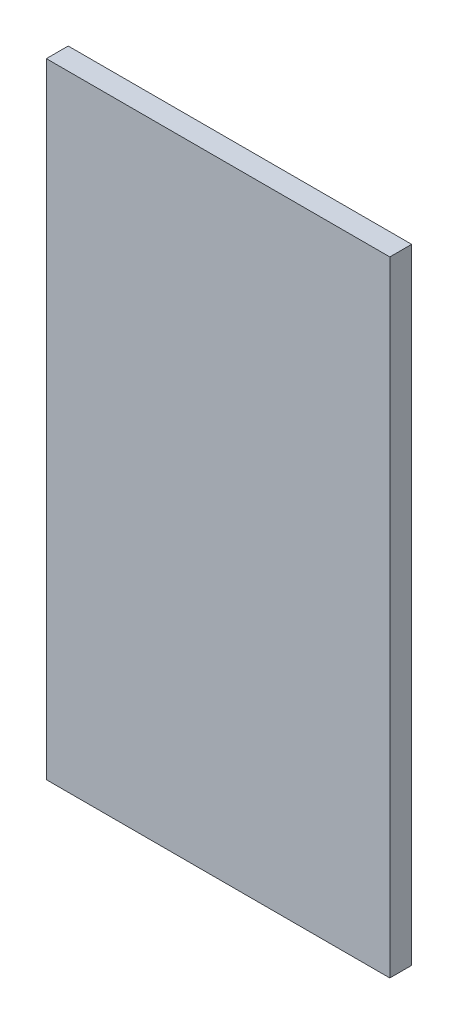
ISO-10303-21;
HEADER;
FILE_DESCRIPTION(('STEP AP214'),'2;1');
FILE_NAME('part.step','',(''),(''),'','','');
FILE_SCHEMA(('AUTOMOTIVE_DESIGN { 1 0 10303 214 1 1 1 1 }'));
ENDSEC;
DATA;
#1=APPLICATION_CONTEXT('core data for automotive mechanical design processes');
#2=APPLICATION_PROTOCOL_DEFINITION('international standard','automotive_design',2000,#1);
#3=PRODUCT_CONTEXT('',#1,'mechanical');
#4=PRODUCT('Part','Part','',(#3));
#5=PRODUCT_RELATED_PRODUCT_CATEGORY('part','',(#4));
#6=PRODUCT_DEFINITION_FORMATION('','',#4);
#7=PRODUCT_DEFINITION_CONTEXT('part definition',#1,'design');
#8=PRODUCT_DEFINITION('design','',#6,#7);
#9=PRODUCT_DEFINITION_SHAPE('','',#8);
#10=(LENGTH_UNIT() NAMED_UNIT(*) SI_UNIT(.MILLI.,.METRE.));
#11=(NAMED_UNIT(*) PLANE_ANGLE_UNIT() SI_UNIT($,.RADIAN.));
#12=(NAMED_UNIT(*) SI_UNIT($,.STERADIAN.) SOLID_ANGLE_UNIT());
#13=UNCERTAINTY_MEASURE_WITH_UNIT(LENGTH_MEASURE(1.E-05),#10,'distance_accuracy_value','');
#14=(GEOMETRIC_REPRESENTATION_CONTEXT(3) GLOBAL_UNCERTAINTY_ASSIGNED_CONTEXT((#13)) GLOBAL_UNIT_ASSIGNED_CONTEXT((#10,
#11,#12)) REPRESENTATION_CONTEXT('',''));
#15=CARTESIAN_POINT('',(0.,0.,0.));
#16=DIRECTION('',(0.,0.,1.));
#17=DIRECTION('',(1.,0.,0.));
#18=AXIS2_PLACEMENT_3D('',#15,#16,#17);
#19=CARTESIAN_POINT('',(0.,0.,7.));
#20=DIRECTION('',(0.,1.,0.));
#21=DIRECTION('',(0.,0.,1.));
#22=AXIS2_PLACEMENT_3D('',#19,#20,#21);
#23=PLANE('',#22);
#24=DIRECTION('',(1.,0.,0.));
#25=VECTOR('',#24,1.);
#26=CARTESIAN_POINT('',(0.,0.,0.));
#27=LINE('',#26,#25);
#28=CARTESIAN_POINT('',(0.,0.,0.));
#29=VERTEX_POINT('',#28);
#30=CARTESIAN_POINT('',(110.,0.,0.));
#31=VERTEX_POINT('',#30);
#32=EDGE_CURVE('E104',#29,#31,#27,.T.);
#33=ORIENTED_EDGE('',*,*,#32,.T.);
#34=DIRECTION('',(0.,0.,-1.));
#35=VECTOR('',#34,1.);
#36=CARTESIAN_POINT('',(110.,0.,7.));
#37=LINE('',#36,#35);
#38=CARTESIAN_POINT('',(110.,0.,7.));
#39=VERTEX_POINT('',#38);
#40=EDGE_CURVE('E11',#39,#31,#37,.T.);
#41=ORIENTED_EDGE('',*,*,#40,.F.);
#42=DIRECTION('',(1.,0.,0.));
#43=VECTOR('',#42,1.);
#44=CARTESIAN_POINT('',(0.,0.,7.));
#45=LINE('',#44,#43);
#46=CARTESIAN_POINT('',(0.,0.,7.));
#47=VERTEX_POINT('',#46);
#48=EDGE_CURVE('E90',#47,#39,#45,.T.);
#49=ORIENTED_EDGE('',*,*,#48,.F.);
#50=DIRECTION('',(0.,0.,-1.));
#51=VECTOR('',#50,1.);
#52=CARTESIAN_POINT('',(0.,0.,7.));
#53=LINE('',#52,#51);
#54=EDGE_CURVE('E57',#47,#29,#53,.T.);
#55=ORIENTED_EDGE('',*,*,#54,.T.);
#56=EDGE_LOOP('',(#33,#41,#49,#55));
#57=FACE_BOUND('',#56,.T.);
#58=ADVANCED_FACE('F41',(#57),#23,.F.);
#59=CARTESIAN_POINT('',(110.,0.,7.));
#60=DIRECTION('',(-1.,0.,0.));
#61=DIRECTION('',(0.,0.,1.));
#62=AXIS2_PLACEMENT_3D('',#59,#60,#61);
#63=PLANE('',#62);
#64=DIRECTION('',(0.,1.,0.));
#65=VECTOR('',#64,1.);
#66=CARTESIAN_POINT('',(110.,0.,0.));
#67=LINE('',#66,#65);
#68=CARTESIAN_POINT('',(110.,200.,0.));
#69=VERTEX_POINT('',#68);
#70=EDGE_CURVE('E95',#31,#69,#67,.T.);
#71=ORIENTED_EDGE('',*,*,#70,.T.);
#72=DIRECTION('',(0.,0.,-1.));
#73=VECTOR('',#72,1.);
#74=CARTESIAN_POINT('',(110.,200.,7.));
#75=LINE('',#74,#73);
#76=CARTESIAN_POINT('',(110.,200.,7.));
#77=VERTEX_POINT('',#76);
#78=EDGE_CURVE('E49',#77,#69,#75,.T.);
#79=ORIENTED_EDGE('',*,*,#78,.F.);
#80=DIRECTION('',(0.,1.,0.));
#81=VECTOR('',#80,1.);
#82=CARTESIAN_POINT('',(110.,0.,7.));
#83=LINE('',#82,#81);
#84=EDGE_CURVE('E82',#39,#77,#83,.T.);
#85=ORIENTED_EDGE('',*,*,#84,.F.);
#86=ORIENTED_EDGE('',*,*,#40,.T.);
#87=EDGE_LOOP('',(#71,#79,#85,#86));
#88=FACE_BOUND('',#87,.T.);
#89=ADVANCED_FACE('F94',(#88),#63,.F.);
#90=CARTESIAN_POINT('',(0.,200.,7.));
#91=DIRECTION('',(0.,1.,0.));
#92=DIRECTION('',(0.,0.,1.));
#93=AXIS2_PLACEMENT_3D('',#90,#91,#92);
#94=PLANE('',#93);
#95=DIRECTION('',(1.,0.,0.));
#96=VECTOR('',#95,1.);
#97=CARTESIAN_POINT('',(0.,200.,0.));
#98=LINE('',#97,#96);
#99=CARTESIAN_POINT('',(0.,200.,0.));
#100=VERTEX_POINT('',#99);
#101=EDGE_CURVE('E107',#100,#69,#98,.T.);
#102=ORIENTED_EDGE('',*,*,#101,.F.);
#103=DIRECTION('',(0.,0.,-1.));
#104=VECTOR('',#103,1.);
#105=CARTESIAN_POINT('',(0.,200.,7.));
#106=LINE('',#105,#104);
#107=CARTESIAN_POINT('',(0.,200.,7.));
#108=VERTEX_POINT('',#107);
#109=EDGE_CURVE('E71',#108,#100,#106,.T.);
#110=ORIENTED_EDGE('',*,*,#109,.F.);
#111=DIRECTION('',(1.,0.,0.));
#112=VECTOR('',#111,1.);
#113=CARTESIAN_POINT('',(0.,200.,7.));
#114=LINE('',#113,#112);
#115=EDGE_CURVE('E89',#108,#77,#114,.T.);
#116=ORIENTED_EDGE('',*,*,#115,.T.);
#117=ORIENTED_EDGE('',*,*,#78,.T.);
#118=EDGE_LOOP('',(#102,#110,#116,#117));
#119=FACE_BOUND('',#118,.T.);
#120=ADVANCED_FACE('F98',(#119),#94,.T.);
#121=CARTESIAN_POINT('',(0.,0.,7.));
#122=DIRECTION('',(-1.,0.,0.));
#123=DIRECTION('',(0.,0.,1.));
#124=AXIS2_PLACEMENT_3D('',#121,#122,#123);
#125=PLANE('',#124);
#126=DIRECTION('',(0.,1.,0.));
#127=VECTOR('',#126,1.);
#128=CARTESIAN_POINT('',(0.,0.,0.));
#129=LINE('',#128,#127);
#130=EDGE_CURVE('E109',#29,#100,#129,.T.);
#131=ORIENTED_EDGE('',*,*,#130,.F.);
#132=ORIENTED_EDGE('',*,*,#54,.F.);
#133=DIRECTION('',(0.,1.,0.));
#134=VECTOR('',#133,1.);
#135=CARTESIAN_POINT('',(0.,0.,7.));
#136=LINE('',#135,#134);
#137=EDGE_CURVE('E99',#47,#108,#136,.T.);
#138=ORIENTED_EDGE('',*,*,#137,.T.);
#139=ORIENTED_EDGE('',*,*,#109,.T.);
#140=EDGE_LOOP('',(#131,#132,#138,#139));
#141=FACE_BOUND('',#140,.T.);
#142=ADVANCED_FACE('F115',(#141),#125,.T.);
#143=CARTESIAN_POINT('',(0.,0.,7.));
#144=DIRECTION('',(0.,0.,1.));
#145=DIRECTION('',(1.,0.,0.));
#146=AXIS2_PLACEMENT_3D('',#143,#144,#145);
#147=PLANE('',#146);
#148=ORIENTED_EDGE('',*,*,#48,.T.);
#149=ORIENTED_EDGE('',*,*,#84,.T.);
#150=ORIENTED_EDGE('',*,*,#115,.F.);
#151=ORIENTED_EDGE('',*,*,#137,.F.);
#152=EDGE_LOOP('',(#148,#149,#150,#151));
#153=FACE_BOUND('',#152,.T.);
#154=ADVANCED_FACE('F86',(#153),#147,.T.);
#155=CARTESIAN_POINT('',(0.,0.,0.));
#156=DIRECTION('',(0.,0.,1.));
#157=DIRECTION('',(1.,0.,0.));
#158=AXIS2_PLACEMENT_3D('',#155,#156,#157);
#159=PLANE('',#158);
#160=ORIENTED_EDGE('',*,*,#32,.F.);
#161=ORIENTED_EDGE('',*,*,#130,.T.);
#162=ORIENTED_EDGE('',*,*,#101,.T.);
#163=ORIENTED_EDGE('',*,*,#70,.F.);
#164=EDGE_LOOP('',(#160,#161,#162,#163));
#165=FACE_BOUND('',#164,.T.);
#166=ADVANCED_FACE('F114',(#165),#159,.F.);
#167=CLOSED_SHELL('',(#58,#89,#120,#142,#154,#166));
#168=MANIFOLD_SOLID_BREP('B2',#167);
#169=ADVANCED_BREP_SHAPE_REPRESENTATION('',(#18,#168),#14);
#170=SHAPE_DEFINITION_REPRESENTATION(#9,#169);
ENDSEC;
END-ISO-10303-21;
